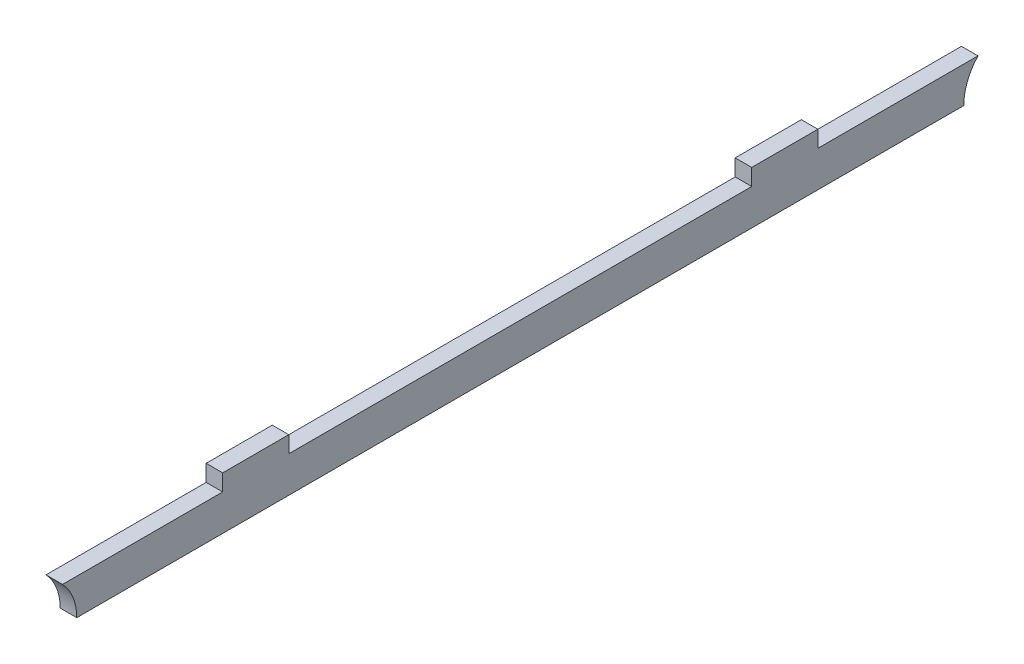
ISO-10303-21;
HEADER;
FILE_DESCRIPTION(('STEP AP214'),'2;1');
FILE_NAME('part.step','',(''),(''),'','','');
FILE_SCHEMA(('AUTOMOTIVE_DESIGN { 1 0 10303 214 1 1 1 1 }'));
ENDSEC;
DATA;
#1=APPLICATION_CONTEXT('core data for automotive mechanical design processes');
#2=APPLICATION_PROTOCOL_DEFINITION('international standard','automotive_design',2000,#1);
#3=PRODUCT_CONTEXT('',#1,'mechanical');
#4=PRODUCT('Part','Part','',(#3));
#5=PRODUCT_RELATED_PRODUCT_CATEGORY('part','',(#4));
#6=PRODUCT_DEFINITION_FORMATION('','',#4);
#7=PRODUCT_DEFINITION_CONTEXT('part definition',#1,'design');
#8=PRODUCT_DEFINITION('design','',#6,#7);
#9=PRODUCT_DEFINITION_SHAPE('','',#8);
#10=(LENGTH_UNIT() NAMED_UNIT(*) SI_UNIT(.MILLI.,.METRE.));
#11=(NAMED_UNIT(*) PLANE_ANGLE_UNIT() SI_UNIT($,.RADIAN.));
#12=(NAMED_UNIT(*) SI_UNIT($,.STERADIAN.) SOLID_ANGLE_UNIT());
#13=UNCERTAINTY_MEASURE_WITH_UNIT(LENGTH_MEASURE(1.E-05),#10,'distance_accuracy_value','');
#14=(GEOMETRIC_REPRESENTATION_CONTEXT(3) GLOBAL_UNCERTAINTY_ASSIGNED_CONTEXT((#13)) GLOBAL_UNIT_ASSIGNED_CONTEXT((#10,
#11,#12)) REPRESENTATION_CONTEXT('',''));
#15=CARTESIAN_POINT('',(0.,0.,0.));
#16=DIRECTION('',(0.,0.,1.));
#17=DIRECTION('',(1.,0.,0.));
#18=AXIS2_PLACEMENT_3D('',#15,#16,#17);
#19=CARTESIAN_POINT('',(2.5,0.,-150.));
#20=DIRECTION('',(-1.,0.,0.));
#21=DIRECTION('',(0.,0.,1.));
#22=AXIS2_PLACEMENT_3D('',#19,#20,#21);
#23=CYLINDRICAL_SURFACE('',#22,15.875);
#24=CARTESIAN_POINT('',(-2.5,0.,-150.));
#25=DIRECTION('',(1.,0.,0.));
#26=DIRECTION('',(0.,0.,-1.));
#27=AXIS2_PLACEMENT_3D('',#24,#25,#26);
#28=CIRCLE('',#27,15.875);
#29=CARTESIAN_POINT('',(-2.5,10.875,-138.43496649378));
#30=VERTEX_POINT('',#29);
#31=CARTESIAN_POINT('',(-2.5,0.,-134.125));
#32=VERTEX_POINT('',#31);
#33=EDGE_CURVE('E159',#30,#32,#28,.T.);
#34=ORIENTED_EDGE('',*,*,#33,.F.);
#35=DIRECTION('',(-1.,0.,0.));
#36=VECTOR('',#35,1.);
#37=CARTESIAN_POINT('',(2.5,10.875,-138.43496649378));
#38=LINE('',#37,#36);
#39=CARTESIAN_POINT('',(2.5,10.875,-138.43496649378));
#40=VERTEX_POINT('',#39);
#41=EDGE_CURVE('E11',#40,#30,#38,.T.);
#42=ORIENTED_EDGE('',*,*,#41,.F.);
#43=CARTESIAN_POINT('',(2.5,0.,-150.));
#44=DIRECTION('',(1.,0.,0.));
#45=DIRECTION('',(0.,0.,-1.));
#46=AXIS2_PLACEMENT_3D('',#43,#44,#45);
#47=CIRCLE('',#46,15.875);
#48=CARTESIAN_POINT('',(2.5,0.,-134.125));
#49=VERTEX_POINT('',#48);
#50=EDGE_CURVE('E186',#40,#49,#47,.T.);
#51=ORIENTED_EDGE('',*,*,#50,.T.);
#52=DIRECTION('',(-1.,0.,0.));
#53=VECTOR('',#52,1.);
#54=CARTESIAN_POINT('',(2.5,0.,-134.125));
#55=LINE('',#54,#53);
#56=EDGE_CURVE('E102',#49,#32,#55,.T.);
#57=ORIENTED_EDGE('',*,*,#56,.T.);
#58=EDGE_LOOP('',(#34,#42,#51,#57));
#59=FACE_BOUND('',#58,.T.);
#60=ADVANCED_FACE('F40',(#59),#23,.F.);
#61=CARTESIAN_POINT('',(2.5,10.875,0.));
#62=DIRECTION('',(0.,1.,0.));
#63=DIRECTION('',(0.,0.,1.));
#64=AXIS2_PLACEMENT_3D('',#61,#62,#63);
#65=PLANE('',#64);
#66=DIRECTION('',(0.,0.,-1.));
#67=VECTOR('',#66,1.);
#68=CARTESIAN_POINT('',(-2.5,10.875,0.));
#69=LINE('',#68,#67);
#70=CARTESIAN_POINT('',(-2.5,10.875,-90.));
#71=VERTEX_POINT('',#70);
#72=EDGE_CURVE('E162',#71,#30,#69,.T.);
#73=ORIENTED_EDGE('',*,*,#72,.F.);
#74=DIRECTION('',(-1.,0.,0.));
#75=VECTOR('',#74,1.);
#76=CARTESIAN_POINT('',(2.5,10.875,-90.));
#77=LINE('',#76,#75);
#78=CARTESIAN_POINT('',(2.5,10.875,-90.));
#79=VERTEX_POINT('',#78);
#80=EDGE_CURVE('E48',#79,#71,#77,.T.);
#81=ORIENTED_EDGE('',*,*,#80,.F.);
#82=DIRECTION('',(0.,0.,-1.));
#83=VECTOR('',#82,1.);
#84=CARTESIAN_POINT('',(2.5,10.875,0.));
#85=LINE('',#84,#83);
#86=EDGE_CURVE('E152',#79,#40,#85,.T.);
#87=ORIENTED_EDGE('',*,*,#86,.T.);
#88=ORIENTED_EDGE('',*,*,#41,.T.);
#89=EDGE_LOOP('',(#73,#81,#87,#88));
#90=FACE_BOUND('',#89,.T.);
#91=ADVANCED_FACE('F213',(#90),#65,.T.);
#92=CARTESIAN_POINT('',(2.5,0.,-90.));
#93=DIRECTION('',(0.,0.,-1.));
#94=DIRECTION('',(-1.,0.,0.));
#95=AXIS2_PLACEMENT_3D('',#92,#93,#94);
#96=PLANE('',#95);
#97=DIRECTION('',(0.,-1.,0.));
#98=VECTOR('',#97,1.);
#99=CARTESIAN_POINT('',(-2.5,0.,-90.));
#100=LINE('',#99,#98);
#101=CARTESIAN_POINT('',(-2.5,15.875,-90.));
#102=VERTEX_POINT('',#101);
#103=EDGE_CURVE('E165',#102,#71,#100,.T.);
#104=ORIENTED_EDGE('',*,*,#103,.F.);
#105=DIRECTION('',(-1.,0.,0.));
#106=VECTOR('',#105,1.);
#107=CARTESIAN_POINT('',(2.5,15.875,-90.));
#108=LINE('',#107,#106);
#109=CARTESIAN_POINT('',(2.5,15.875,-90.));
#110=VERTEX_POINT('',#109);
#111=EDGE_CURVE('E202',#110,#102,#108,.T.);
#112=ORIENTED_EDGE('',*,*,#111,.F.);
#113=DIRECTION('',(0.,-1.,0.));
#114=VECTOR('',#113,1.);
#115=CARTESIAN_POINT('',(2.5,0.,-90.));
#116=LINE('',#115,#114);
#117=EDGE_CURVE('E209',#110,#79,#116,.T.);
#118=ORIENTED_EDGE('',*,*,#117,.T.);
#119=ORIENTED_EDGE('',*,*,#80,.T.);
#120=EDGE_LOOP('',(#104,#112,#118,#119));
#121=FACE_BOUND('',#120,.T.);
#122=ADVANCED_FACE('F207',(#121),#96,.T.);
#123=CARTESIAN_POINT('',(2.5,15.875,0.));
#124=DIRECTION('',(0.,-1.,0.));
#125=DIRECTION('',(0.,0.,-1.));
#126=AXIS2_PLACEMENT_3D('',#123,#124,#125);
#127=PLANE('',#126);
#128=DIRECTION('',(0.,0.,1.));
#129=VECTOR('',#128,1.);
#130=CARTESIAN_POINT('',(-2.5,15.875,0.));
#131=LINE('',#130,#129);
#132=CARTESIAN_POINT('',(-2.5,15.875,-70.));
#133=VERTEX_POINT('',#132);
#134=EDGE_CURVE('E169',#102,#133,#131,.T.);
#135=ORIENTED_EDGE('',*,*,#134,.T.);
#136=DIRECTION('',(-1.,0.,0.));
#137=VECTOR('',#136,1.);
#138=CARTESIAN_POINT('',(2.5,15.875,-70.));
#139=LINE('',#138,#137);
#140=CARTESIAN_POINT('',(2.5,15.875,-70.));
#141=VERTEX_POINT('',#140);
#142=EDGE_CURVE('E199',#141,#133,#139,.T.);
#143=ORIENTED_EDGE('',*,*,#142,.F.);
#144=DIRECTION('',(0.,0.,1.));
#145=VECTOR('',#144,1.);
#146=CARTESIAN_POINT('',(2.5,15.875,0.));
#147=LINE('',#146,#145);
#148=EDGE_CURVE('E230',#110,#141,#147,.T.);
#149=ORIENTED_EDGE('',*,*,#148,.F.);
#150=ORIENTED_EDGE('',*,*,#111,.T.);
#151=EDGE_LOOP('',(#135,#143,#149,#150));
#152=FACE_BOUND('',#151,.T.);
#153=ADVANCED_FACE('F221',(#152),#127,.F.);
#154=CARTESIAN_POINT('',(2.5,0.,-70.));
#155=DIRECTION('',(0.,0.,-1.));
#156=DIRECTION('',(-1.,0.,0.));
#157=AXIS2_PLACEMENT_3D('',#154,#155,#156);
#158=PLANE('',#157);
#159=DIRECTION('',(0.,-1.,0.));
#160=VECTOR('',#159,1.);
#161=CARTESIAN_POINT('',(-2.5,0.,-70.));
#162=LINE('',#161,#160);
#163=CARTESIAN_POINT('',(-2.5,10.875,-70.));
#164=VERTEX_POINT('',#163);
#165=EDGE_CURVE('E171',#133,#164,#162,.T.);
#166=ORIENTED_EDGE('',*,*,#165,.T.);
#167=DIRECTION('',(-1.,0.,0.));
#168=VECTOR('',#167,1.);
#169=CARTESIAN_POINT('',(2.5,10.875,-70.));
#170=LINE('',#169,#168);
#171=CARTESIAN_POINT('',(2.5,10.875,-70.));
#172=VERTEX_POINT('',#171);
#173=EDGE_CURVE('E197',#172,#164,#170,.T.);
#174=ORIENTED_EDGE('',*,*,#173,.F.);
#175=DIRECTION('',(0.,-1.,0.));
#176=VECTOR('',#175,1.);
#177=CARTESIAN_POINT('',(2.5,0.,-70.));
#178=LINE('',#177,#176);
#179=EDGE_CURVE('E227',#141,#172,#178,.T.);
#180=ORIENTED_EDGE('',*,*,#179,.F.);
#181=ORIENTED_EDGE('',*,*,#142,.T.);
#182=EDGE_LOOP('',(#166,#174,#180,#181));
#183=FACE_BOUND('',#182,.T.);
#184=ADVANCED_FACE('F225',(#183),#158,.F.);
#185=CARTESIAN_POINT('',(-2.5,10.875,70.));
#186=VERTEX_POINT('',#185);
#187=EDGE_CURVE('E166',#186,#164,#69,.T.);
#188=ORIENTED_EDGE('',*,*,#187,.F.);
#189=DIRECTION('',(-1.,0.,0.));
#190=VECTOR('',#189,1.);
#191=CARTESIAN_POINT('',(2.5,10.875,70.));
#192=LINE('',#191,#190);
#193=CARTESIAN_POINT('',(2.5,10.875,70.));
#194=VERTEX_POINT('',#193);
#195=EDGE_CURVE('E195',#194,#186,#192,.T.);
#196=ORIENTED_EDGE('',*,*,#195,.F.);
#197=EDGE_CURVE('E151',#194,#172,#85,.T.);
#198=ORIENTED_EDGE('',*,*,#197,.T.);
#199=ORIENTED_EDGE('',*,*,#173,.T.);
#200=EDGE_LOOP('',(#188,#196,#198,#199));
#201=FACE_BOUND('',#200,.T.);
#202=ADVANCED_FACE('F250',(#201),#65,.T.);
#203=CARTESIAN_POINT('',(2.5,0.,70.));
#204=DIRECTION('',(0.,0.,-1.));
#205=DIRECTION('',(-1.,0.,0.));
#206=AXIS2_PLACEMENT_3D('',#203,#204,#205);
#207=PLANE('',#206);
#208=DIRECTION('',(0.,-1.,0.));
#209=VECTOR('',#208,1.);
#210=CARTESIAN_POINT('',(-2.5,0.,70.));
#211=LINE('',#210,#209);
#212=CARTESIAN_POINT('',(-2.5,15.875,70.));
#213=VERTEX_POINT('',#212);
#214=EDGE_CURVE('E174',#213,#186,#211,.T.);
#215=ORIENTED_EDGE('',*,*,#214,.F.);
#216=DIRECTION('',(-1.,0.,0.));
#217=VECTOR('',#216,1.);
#218=CARTESIAN_POINT('',(2.5,15.875,70.));
#219=LINE('',#218,#217);
#220=CARTESIAN_POINT('',(2.5,15.875,70.));
#221=VERTEX_POINT('',#220);
#222=EDGE_CURVE('E193',#221,#213,#219,.T.);
#223=ORIENTED_EDGE('',*,*,#222,.F.);
#224=DIRECTION('',(0.,-1.,0.));
#225=VECTOR('',#224,1.);
#226=CARTESIAN_POINT('',(2.5,0.,70.));
#227=LINE('',#226,#225);
#228=EDGE_CURVE('E232',#221,#194,#227,.T.);
#229=ORIENTED_EDGE('',*,*,#228,.T.);
#230=ORIENTED_EDGE('',*,*,#195,.T.);
#231=EDGE_LOOP('',(#215,#223,#229,#230));
#232=FACE_BOUND('',#231,.T.);
#233=ADVANCED_FACE('F252',(#232),#207,.T.);
#234=CARTESIAN_POINT('',(2.5,15.875,0.));
#235=DIRECTION('',(0.,-1.,0.));
#236=DIRECTION('',(0.,0.,-1.));
#237=AXIS2_PLACEMENT_3D('',#234,#235,#236);
#238=PLANE('',#237);
#239=DIRECTION('',(0.,0.,1.));
#240=VECTOR('',#239,1.);
#241=CARTESIAN_POINT('',(-2.5,15.875,0.));
#242=LINE('',#241,#240);
#243=CARTESIAN_POINT('',(-2.5,15.875,90.));
#244=VERTEX_POINT('',#243);
#245=EDGE_CURVE('E177',#213,#244,#242,.T.);
#246=ORIENTED_EDGE('',*,*,#245,.T.);
#247=DIRECTION('',(-1.,0.,0.));
#248=VECTOR('',#247,1.);
#249=CARTESIAN_POINT('',(2.5,15.875,90.));
#250=LINE('',#249,#248);
#251=CARTESIAN_POINT('',(2.5,15.875,90.));
#252=VERTEX_POINT('',#251);
#253=EDGE_CURVE('E190',#252,#244,#250,.T.);
#254=ORIENTED_EDGE('',*,*,#253,.F.);
#255=DIRECTION('',(0.,0.,1.));
#256=VECTOR('',#255,1.);
#257=CARTESIAN_POINT('',(2.5,15.875,0.));
#258=LINE('',#257,#256);
#259=EDGE_CURVE('E237',#221,#252,#258,.T.);
#260=ORIENTED_EDGE('',*,*,#259,.F.);
#261=ORIENTED_EDGE('',*,*,#222,.T.);
#262=EDGE_LOOP('',(#246,#254,#260,#261));
#263=FACE_BOUND('',#262,.T.);
#264=ADVANCED_FACE('F242',(#263),#238,.F.);
#265=CARTESIAN_POINT('',(2.5,0.,90.));
#266=DIRECTION('',(0.,0.,-1.));
#267=DIRECTION('',(-1.,0.,0.));
#268=AXIS2_PLACEMENT_3D('',#265,#266,#267);
#269=PLANE('',#268);
#270=DIRECTION('',(0.,-1.,0.));
#271=VECTOR('',#270,1.);
#272=CARTESIAN_POINT('',(-2.5,0.,90.));
#273=LINE('',#272,#271);
#274=CARTESIAN_POINT('',(-2.5,10.875,90.));
#275=VERTEX_POINT('',#274);
#276=EDGE_CURVE('E179',#244,#275,#273,.T.);
#277=ORIENTED_EDGE('',*,*,#276,.T.);
#278=DIRECTION('',(-1.,0.,0.));
#279=VECTOR('',#278,1.);
#280=CARTESIAN_POINT('',(2.5,10.875,90.));
#281=LINE('',#280,#279);
#282=CARTESIAN_POINT('',(2.5,10.875,90.));
#283=VERTEX_POINT('',#282);
#284=EDGE_CURVE('E143',#283,#275,#281,.T.);
#285=ORIENTED_EDGE('',*,*,#284,.F.);
#286=DIRECTION('',(0.,-1.,0.));
#287=VECTOR('',#286,1.);
#288=CARTESIAN_POINT('',(2.5,0.,90.));
#289=LINE('',#288,#287);
#290=EDGE_CURVE('E148',#252,#283,#289,.T.);
#291=ORIENTED_EDGE('',*,*,#290,.F.);
#292=ORIENTED_EDGE('',*,*,#253,.T.);
#293=EDGE_LOOP('',(#277,#285,#291,#292));
#294=FACE_BOUND('',#293,.T.);
#295=ADVANCED_FACE('F246',(#294),#269,.F.);
#296=CARTESIAN_POINT('',(-2.5,10.875,138.43496649378));
#297=VERTEX_POINT('',#296);
#298=EDGE_CURVE('E138',#297,#275,#69,.T.);
#299=ORIENTED_EDGE('',*,*,#298,.F.);
#300=DIRECTION('',(-1.,0.,0.));
#301=VECTOR('',#300,1.);
#302=CARTESIAN_POINT('',(2.5,10.875,138.43496649378));
#303=LINE('',#302,#301);
#304=CARTESIAN_POINT('',(2.5,10.875,138.43496649378));
#305=VERTEX_POINT('',#304);
#306=EDGE_CURVE('E133',#305,#297,#303,.T.);
#307=ORIENTED_EDGE('',*,*,#306,.F.);
#308=EDGE_CURVE('E136',#305,#283,#85,.T.);
#309=ORIENTED_EDGE('',*,*,#308,.T.);
#310=ORIENTED_EDGE('',*,*,#284,.T.);
#311=EDGE_LOOP('',(#299,#307,#309,#310));
#312=FACE_BOUND('',#311,.T.);
#313=ADVANCED_FACE('F135',(#312),#65,.T.);
#314=CARTESIAN_POINT('',(2.5,0.,150.));
#315=DIRECTION('',(-1.,0.,0.));
#316=DIRECTION('',(0.,0.,1.));
#317=AXIS2_PLACEMENT_3D('',#314,#315,#316);
#318=CYLINDRICAL_SURFACE('',#317,15.875);
#319=CARTESIAN_POINT('',(-2.5,0.,150.));
#320=DIRECTION('',(1.,0.,0.));
#321=DIRECTION('',(0.,0.,-1.));
#322=AXIS2_PLACEMENT_3D('',#319,#320,#321);
#323=CIRCLE('',#322,15.875);
#324=CARTESIAN_POINT('',(-2.5,0.,134.125));
#325=VERTEX_POINT('',#324);
#326=EDGE_CURVE('E182',#325,#297,#323,.T.);
#327=ORIENTED_EDGE('',*,*,#326,.F.);
#328=DIRECTION('',(-1.,0.,0.));
#329=VECTOR('',#328,1.);
#330=CARTESIAN_POINT('',(2.5,0.,134.125));
#331=LINE('',#330,#329);
#332=CARTESIAN_POINT('',(2.5,0.,134.125));
#333=VERTEX_POINT('',#332);
#334=EDGE_CURVE('E95',#333,#325,#331,.T.);
#335=ORIENTED_EDGE('',*,*,#334,.F.);
#336=CARTESIAN_POINT('',(2.5,0.,150.));
#337=DIRECTION('',(1.,0.,0.));
#338=DIRECTION('',(0.,0.,-1.));
#339=AXIS2_PLACEMENT_3D('',#336,#337,#338);
#340=CIRCLE('',#339,15.875);
#341=EDGE_CURVE('E146',#333,#305,#340,.T.);
#342=ORIENTED_EDGE('',*,*,#341,.T.);
#343=ORIENTED_EDGE('',*,*,#306,.T.);
#344=EDGE_LOOP('',(#327,#335,#342,#343));
#345=FACE_BOUND('',#344,.T.);
#346=ADVANCED_FACE('F153',(#345),#318,.F.);
#347=CARTESIAN_POINT('',(2.5,0.,0.));
#348=DIRECTION('',(0.,1.,0.));
#349=DIRECTION('',(0.,0.,1.));
#350=AXIS2_PLACEMENT_3D('',#347,#348,#349);
#351=PLANE('',#350);
#352=DIRECTION('',(0.,0.,-1.));
#353=VECTOR('',#352,1.);
#354=CARTESIAN_POINT('',(-2.5,0.,0.));
#355=LINE('',#354,#353);
#356=EDGE_CURVE('E184',#325,#32,#355,.T.);
#357=ORIENTED_EDGE('',*,*,#356,.T.);
#358=ORIENTED_EDGE('',*,*,#56,.F.);
#359=DIRECTION('',(0.,0.,-1.));
#360=VECTOR('',#359,1.);
#361=CARTESIAN_POINT('',(2.5,0.,0.));
#362=LINE('',#361,#360);
#363=EDGE_CURVE('E56',#333,#49,#362,.T.);
#364=ORIENTED_EDGE('',*,*,#363,.F.);
#365=ORIENTED_EDGE('',*,*,#334,.T.);
#366=EDGE_LOOP('',(#357,#358,#364,#365));
#367=FACE_BOUND('',#366,.T.);
#368=ADVANCED_FACE('F266',(#367),#351,.F.);
#369=CARTESIAN_POINT('',(2.5,0.,0.));
#370=DIRECTION('',(1.,0.,0.));
#371=DIRECTION('',(0.,0.,-1.));
#372=AXIS2_PLACEMENT_3D('',#369,#370,#371);
#373=PLANE('',#372);
#374=ORIENTED_EDGE('',*,*,#50,.F.);
#375=ORIENTED_EDGE('',*,*,#86,.F.);
#376=ORIENTED_EDGE('',*,*,#117,.F.);
#377=ORIENTED_EDGE('',*,*,#148,.T.);
#378=ORIENTED_EDGE('',*,*,#179,.T.);
#379=ORIENTED_EDGE('',*,*,#197,.F.);
#380=ORIENTED_EDGE('',*,*,#228,.F.);
#381=ORIENTED_EDGE('',*,*,#259,.T.);
#382=ORIENTED_EDGE('',*,*,#290,.T.);
#383=ORIENTED_EDGE('',*,*,#308,.F.);
#384=ORIENTED_EDGE('',*,*,#341,.F.);
#385=ORIENTED_EDGE('',*,*,#363,.T.);
#386=EDGE_LOOP('',(#374,#375,#376,#377,#378,#379,#380,#381,#382,#383,#384,#385));
#387=FACE_BOUND('',#386,.T.);
#388=ADVANCED_FACE('F145',(#387),#373,.T.);
#389=CARTESIAN_POINT('',(-2.5,0.,0.));
#390=DIRECTION('',(1.,0.,0.));
#391=DIRECTION('',(0.,0.,-1.));
#392=AXIS2_PLACEMENT_3D('',#389,#390,#391);
#393=PLANE('',#392);
#394=ORIENTED_EDGE('',*,*,#33,.T.);
#395=ORIENTED_EDGE('',*,*,#356,.F.);
#396=ORIENTED_EDGE('',*,*,#326,.T.);
#397=ORIENTED_EDGE('',*,*,#298,.T.);
#398=ORIENTED_EDGE('',*,*,#276,.F.);
#399=ORIENTED_EDGE('',*,*,#245,.F.);
#400=ORIENTED_EDGE('',*,*,#214,.T.);
#401=ORIENTED_EDGE('',*,*,#187,.T.);
#402=ORIENTED_EDGE('',*,*,#165,.F.);
#403=ORIENTED_EDGE('',*,*,#134,.F.);
#404=ORIENTED_EDGE('',*,*,#103,.T.);
#405=ORIENTED_EDGE('',*,*,#72,.T.);
#406=EDGE_LOOP('',(#394,#395,#396,#397,#398,#399,#400,#401,#402,#403,#404,#405));
#407=FACE_BOUND('',#406,.T.);
#408=ADVANCED_FACE('F216',(#407),#393,.F.);
#409=CLOSED_SHELL('',(#60,#91,#122,#153,#184,#202,#233,#264,#295,#313,#346,#368,#388,#408));
#410=MANIFOLD_SOLID_BREP('B2',#409);
#411=ADVANCED_BREP_SHAPE_REPRESENTATION('',(#18,#410),#14);
#412=SHAPE_DEFINITION_REPRESENTATION(#9,#411);
ENDSEC;
END-ISO-10303-21;
